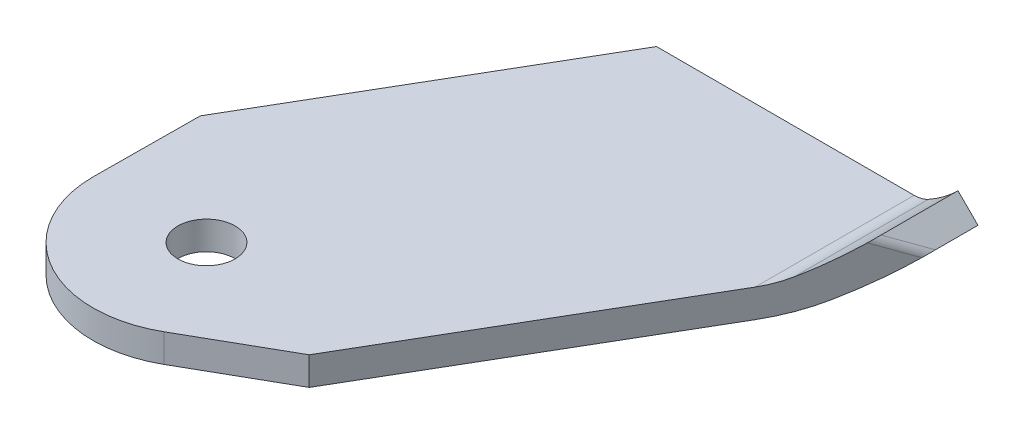
ISO-10303-21;
HEADER;
FILE_DESCRIPTION(('STEP AP214'),'2;1');
FILE_NAME('part.step','',(''),(''),'','','');
FILE_SCHEMA(('AUTOMOTIVE_DESIGN { 1 0 10303 214 1 1 1 1 }'));
ENDSEC;
DATA;
#1=APPLICATION_CONTEXT('core data for automotive mechanical design processes');
#2=APPLICATION_PROTOCOL_DEFINITION('international standard','automotive_design',2000,#1);
#3=PRODUCT_CONTEXT('',#1,'mechanical');
#4=PRODUCT('Part','Part','',(#3));
#5=PRODUCT_RELATED_PRODUCT_CATEGORY('part','',(#4));
#6=PRODUCT_DEFINITION_FORMATION('','',#4);
#7=PRODUCT_DEFINITION_CONTEXT('part definition',#1,'design');
#8=PRODUCT_DEFINITION('design','',#6,#7);
#9=PRODUCT_DEFINITION_SHAPE('','',#8);
#10=(LENGTH_UNIT() NAMED_UNIT(*) SI_UNIT(.MILLI.,.METRE.));
#11=(NAMED_UNIT(*) PLANE_ANGLE_UNIT() SI_UNIT($,.RADIAN.));
#12=(NAMED_UNIT(*) SI_UNIT($,.STERADIAN.) SOLID_ANGLE_UNIT());
#13=UNCERTAINTY_MEASURE_WITH_UNIT(LENGTH_MEASURE(1.E-05),#10,'distance_accuracy_value','');
#14=(GEOMETRIC_REPRESENTATION_CONTEXT(3) GLOBAL_UNCERTAINTY_ASSIGNED_CONTEXT((#13)) GLOBAL_UNIT_ASSIGNED_CONTEXT((#10,
#11,#12)) REPRESENTATION_CONTEXT('',''));
#15=CARTESIAN_POINT('',(0.,0.,0.));
#16=DIRECTION('',(0.,0.,1.));
#17=DIRECTION('',(1.,0.,0.));
#18=AXIS2_PLACEMENT_3D('',#15,#16,#17);
#19=CARTESIAN_POINT('',(-10.456084695359,115.901962595739,38.6729454499609));
#20=DIRECTION('',(0.450417290441647,-0.448428762397305,-0.772033619427306));
#21=DIRECTION('',(-0.86374756690202,0.,-0.503924737109463));
#22=AXIS2_PLACEMENT_3D('',#19,#20,#21);
#23=CYLINDRICAL_SURFACE('',#22,3.);
#24=CARTESIAN_POINT('',(-7.93483152473506,117.625126118079,37.979391350454));
#25=CARTESIAN_POINT('',(-7.93483054293059,117.625127477199,38.0649478684387));
#26=CARTESIAN_POINT('',(-7.93582868921989,117.624124549381,38.1505075727464));
#27=CARTESIAN_POINT('',(-7.93986251081837,117.620073288824,38.3206692474922));
#28=CARTESIAN_POINT('',(-7.94287761276108,117.617045609068,38.4052722031207));
#29=CARTESIAN_POINT('',(-7.9509460541811,117.608946628468,38.5735212678651));
#30=CARTESIAN_POINT('',(-7.95598085607057,117.603893914545,38.6571691494448));
#31=CARTESIAN_POINT('',(-7.96808871180446,117.591749864278,38.8235067847595));
#32=CARTESIAN_POINT('',(-7.9751454763953,117.584674821192,38.9061989087678));
#33=CARTESIAN_POINT('',(-7.99129834359235,117.568491836456,39.070624652166));
#34=CARTESIAN_POINT('',(-8.00038058122044,117.559397717796,39.1523609893333));
#35=CARTESIAN_POINT('',(-8.02058651185715,117.53918325849,39.314874621066));
#36=CARTESIAN_POINT('',(-8.03169891509625,117.528074125692,39.395654711068));
#37=CARTESIAN_POINT('',(-8.0559668781795,117.503838632012,39.5562565616188));
#38=CARTESIAN_POINT('',(-8.06911384927091,117.490720753216,39.6360808968617));
#39=CARTESIAN_POINT('',(-8.09745816948878,117.462473237155,39.7947687952996));
#40=CARTESIAN_POINT('',(-8.11264969847188,117.447349312109,39.8736344170208));
#41=CARTESIAN_POINT('',(-8.1468546797271,117.413342832059,40.0390263913299));
#42=CARTESIAN_POINT('',(-8.16610387964836,117.394230592357,40.1254571618939));
#43=CARTESIAN_POINT('',(-8.20677861540937,117.353914879864,40.294861044084));
#44=CARTESIAN_POINT('',(-8.22813602143134,117.332777274314,40.37786608925));
#45=CARTESIAN_POINT('',(-8.27304002995458,117.288419419526,40.5404133503717));
#46=CARTESIAN_POINT('',(-8.29652103690272,117.265262054567,40.6199907368286));
#47=CARTESIAN_POINT('',(-8.34567936952535,117.21688094078,40.7756800076843));
#48=CARTESIAN_POINT('',(-8.37129486813309,117.191715908444,40.8518295592461));
#49=CARTESIAN_POINT('',(-8.42473075853494,117.139336246609,41.0006607268705));
#50=CARTESIAN_POINT('',(-8.45249419955261,117.112175142482,41.0733815312648));
#51=CARTESIAN_POINT('',(-8.51023321129659,117.05582342348,41.2153539763701));
#52=CARTESIAN_POINT('',(-8.5401578645651,117.026680110428,41.2846450240977));
#53=CARTESIAN_POINT('',(-8.60222905658824,116.966383293369,41.4197580606625));
#54=CARTESIAN_POINT('',(-8.63433171264459,116.935270034976,41.4856180768208));
#55=CARTESIAN_POINT('',(-8.70075890816245,116.871064739446,41.6138709055506));
#56=CARTESIAN_POINT('',(-8.73504761821407,116.838005070949,41.6762985132343));
#57=CARTESIAN_POINT('',(-8.77065232305184,116.803773900834,41.7373155344688));
#58=B_SPLINE_CURVE_WITH_KNOTS('',3,(#24,#25,#26,#27,#28,#29,#30,#31,#32,#33,#34,#35,#36,#37,#38,
#39,#40,#41,#42,#43,#44,#45,#46,#47,#48,#49,#50,#51,#52,#53,#54,#55,#56,#57),.UNSPECIFIED.,.F.,
.F.,(4,2,2,2,2,2,2,2,2,2,2,2,2,2,2,2,4),(0.,0.256662446577546,0.510746011295179,
0.762548989300532,1.01237784490736,1.26054635607007,1.50737463288205,1.75318802140832,
1.99831590873342,2.26999720648141,2.53474061456374,2.79306826012753,3.04554207762139,
3.29276392181494,3.53537473688571,3.77405261707466,4.00950963840103),.UNSPECIFIED.);
#59=CARTESIAN_POINT('',(-7.93483152473503,117.625126118079,37.9793913504539));
#60=VERTEX_POINT('',#59);
#61=CARTESIAN_POINT('',(-8.77065232305181,116.803773900834,41.7373155344687));
#62=VERTEX_POINT('',#61);
#63=EDGE_CURVE('E248',#60,#62,#58,.T.);
#64=ORIENTED_EDGE('',*,*,#63,.F.);
#65=DIRECTION('',(0.450417290441647,-0.448428762397305,-0.772033619427307));
#66=VECTOR('',#65,1.);
#67=CARTESIAN_POINT('',(-8.74342269051327,118.430147469279,39.3653496109387));
#68=LINE('',#67,#66);
#69=CARTESIAN_POINT('',(-14.6671907096273,124.327762898153,49.5189297720377));
#70=VERTEX_POINT('',#69);
#71=EDGE_CURVE('E333',#70,#60,#68,.T.);
#72=ORIENTED_EDGE('',*,*,#71,.F.);
#73=CARTESIAN_POINT('',(-15.5049722204054,123.508362737103,53.280214697237));
#74=CARTESIAN_POINT('',(-15.4682315740175,123.543354162819,53.2172469055204));
#75=CARTESIAN_POINT('',(-15.4329438236482,123.577080956087,53.1527525131535));
#76=CARTESIAN_POINT('',(-15.364468670612,123.642729225121,53.0196967366038));
#77=CARTESIAN_POINT('',(-15.3313411597339,123.674597715511,52.9510783035288));
#78=CARTESIAN_POINT('',(-15.2671670968623,123.736510036142,52.8097814987494));
#79=CARTESIAN_POINT('',(-15.2361888727953,123.766492354669,52.7370453608492));
#80=CARTESIAN_POINT('',(-15.1762846290425,123.824625980085,52.5875127422796));
#81=CARTESIAN_POINT('',(-15.1474334698377,123.852708892579,52.5106598214368));
#82=CARTESIAN_POINT('',(-15.0940923882573,123.904758511682,52.3594741385405));
#83=CARTESIAN_POINT('',(-15.0694480922263,123.928868190941,52.2852446797298));
#84=CARTESIAN_POINT('',(-15.0222467069815,123.975143617954,52.1342016491689));
#85=CARTESIAN_POINT('',(-14.9997264030026,123.997274846068,52.0573660259706));
#86=CARTESIAN_POINT('',(-14.9567546105981,124.039585408688,51.9011129866035));
#87=CARTESIAN_POINT('',(-14.9363439706278,124.059725956701,51.8216738830806));
#88=CARTESIAN_POINT('',(-14.897574991296,124.098047887998,51.6602130570305));
#89=CARTESIAN_POINT('',(-14.87926092853,124.116186785262,51.5781706626278));
#90=CARTESIAN_POINT('',(-14.8458068450344,124.149371582356,51.4169527004037));
#91=CARTESIAN_POINT('',(-14.8305589306193,124.164521990434,51.3378208991374));
#92=CARTESIAN_POINT('',(-14.8020700336802,124.192864421894,51.1781248156776));
#93=CARTESIAN_POINT('',(-14.788847444746,124.206038476542,51.0975540665403));
#94=CARTESIAN_POINT('',(-14.7643979763619,124.230424219875,50.9349811529772));
#95=CARTESIAN_POINT('',(-14.7531921830521,124.241615157776,50.8529727166674));
#96=CARTESIAN_POINT('',(-14.7327668327024,124.262031299777,50.6875240844299));
#97=CARTESIAN_POINT('',(-14.7235708124037,124.271233197559,50.6040781193571));
#98=CARTESIAN_POINT('',(-14.7073664824815,124.287458992798,50.4378730592196));
#99=CARTESIAN_POINT('',(-14.700331201326,124.294509734128,50.3551192023846));
#100=CARTESIAN_POINT('',(-14.6882710972484,124.306602215896,50.1891310858977));
#101=CARTESIAN_POINT('',(-14.6832508184413,124.311639415409,50.1058961650805));
#102=CARTESIAN_POINT('',(-14.6752151811639,124.319704370106,49.9389467195466));
#103=CARTESIAN_POINT('',(-14.6722067449615,124.322725187335,49.8552315284302));
#104=CARTESIAN_POINT('',(-14.668189191057,124.326760006331,49.6873206677586));
#105=CARTESIAN_POINT('',(-14.6671892957897,124.327764751058,49.6031245540018));
#106=CARTESIAN_POINT('',(-14.6671907096273,124.327762898152,49.5189297720377));
#107=B_SPLINE_CURVE_WITH_KNOTS('',3,(#73,#74,#75,#76,#77,#78,#79,#80,#81,#82,#83,#84,#85,#86,
#87,#88,#89,#90,#91,#92,#93,#94,#95,#96,#97,#98,#99,#100,#101,#102,#103,#104,#105,#106),
.UNSPECIFIED.,.F.,.F.,(4,2,2,2,2,2,2,2,2,2,2,2,2,2,2,2,4),(0.,0.242532244796268,
0.490172726903803,0.743709513747707,1.00387709736568,1.2493300935248,1.49845899276499,
1.75174998255762,2.0096657141544,2.25560582996426,2.50366170705772,2.7541769268469,
3.00748506361581,3.25748908813096,3.50805378134933,3.75947623165856,4.01205050069716),.UNSPECIFIED.);
#108=CARTESIAN_POINT('',(-15.5049722204054,123.508362737103,53.280214697237));
#109=VERTEX_POINT('',#108);
#110=EDGE_CURVE('E30',#109,#70,#107,.T.);
#111=ORIENTED_EDGE('',*,*,#110,.F.);
#112=DIRECTION('',(-0.450417290441646,0.448428762397305,0.772033619427307));
#113=VECTOR('',#112,1.);
#114=CARTESIAN_POINT('',(-15.0011613157754,123.006776085703,52.4166622438508));
#115=LINE('',#114,#113);
#116=EDGE_CURVE('E321',#62,#109,#115,.T.);
#117=ORIENTED_EDGE('',*,*,#116,.F.);
#118=EDGE_LOOP('',(#64,#72,#111,#117));
#119=FACE_BOUND('',#118,.T.);
#120=ADVANCED_FACE('F17',(#119),#23,.T.);
#121=CARTESIAN_POINT('',(-29.3784069820497,125.625126118079,103.704684572446));
#122=DIRECTION('',(0.,0.,-1.));
#123=DIRECTION('',(-1.,0.,0.));
#124=AXIS2_PLACEMENT_3D('',#121,#122,#123);
#125=CYLINDRICAL_SURFACE('',#124,19.5);
#126=CARTESIAN_POINT('',(-29.3784069820497,106.125126118079,77.0598481176562));
#127=CARTESIAN_POINT('',(-26.0536113774372,106.125126118079,71.361012751083));
#128=CARTESIAN_POINT('',(-22.8346710941793,106.957405677643,65.8436177257559));
#129=CARTESIAN_POINT('',(-19.9265563010478,108.568968323779,60.8589902767299));
#130=(BOUNDED_CURVE() B_SPLINE_CURVE(3,(#126,#127,#128,#129),.UNSPECIFIED.,.F.,
.F.) B_SPLINE_CURVE_WITH_KNOTS((4,4),(4.71238898038469,5.21842089892061),
.UNSPECIFIED.) CURVE() GEOMETRIC_REPRESENTATION_ITEM() RATIONAL_B_SPLINE_CURVE((1.,
0.978774570641756,0.978774570641756,1.)) REPRESENTATION_ITEM(''));
#131=CARTESIAN_POINT('',(-29.3784069820497,106.125126118079,77.0598481176562));
#132=VERTEX_POINT('',#131);
#133=CARTESIAN_POINT('',(-19.9265563010478,108.568968323779,60.8589902767299));
#134=VERTEX_POINT('',#133);
#135=EDGE_CURVE('E141',#132,#134,#130,.T.);
#136=ORIENTED_EDGE('',*,*,#135,.F.);
#137=DIRECTION('',(0.,0.,1.));
#138=VECTOR('',#137,1.);
#139=CARTESIAN_POINT('',(-29.3784069820497,106.125126118079,156.214684572446));
#140=LINE('',#139,#138);
#141=CARTESIAN_POINT('',(-29.3784069820497,106.125126118079,23.7046845724459));
#142=VERTEX_POINT('',#141);
#143=EDGE_CURVE('E230',#142,#132,#140,.T.);
#144=ORIENTED_EDGE('',*,*,#143,.F.);
#145=CARTESIAN_POINT('',(-29.3784069820497,125.625126118079,23.7046845724459));
#146=DIRECTION('',(0.,0.,-1.));
#147=DIRECTION('',(1.,0.,0.));
#148=AXIS2_PLACEMENT_3D('',#145,#146,#147);
#149=CIRCLE('',#148,19.5);
#150=CARTESIAN_POINT('',(-19.9265563010478,108.568968323779,23.7046845724459));
#151=VERTEX_POINT('',#150);
#152=EDGE_CURVE('E186',#151,#142,#149,.T.);
#153=ORIENTED_EDGE('',*,*,#152,.F.);
#154=DIRECTION('',(0.,0.,-1.));
#155=VECTOR('',#154,1.);
#156=CARTESIAN_POINT('',(-19.9265563010478,108.568968323779,103.704684572446));
#157=LINE('',#156,#155);
#158=EDGE_CURVE('E243',#134,#151,#157,.T.);
#159=ORIENTED_EDGE('',*,*,#158,.F.);
#160=EDGE_LOOP('',(#136,#144,#153,#159));
#161=FACE_BOUND('',#160,.T.);
#162=ADVANCED_FACE('F19',(#161),#125,.T.);
#163=CARTESIAN_POINT('',(-29.3784069820497,125.625126118079,103.704684572446));
#164=DIRECTION('',(0.,0.,-1.));
#165=DIRECTION('',(-1.,0.,0.));
#166=AXIS2_PLACEMENT_3D('',#163,#164,#165);
#167=CYLINDRICAL_SURFACE('',#166,10.);
#168=CARTESIAN_POINT('',(-24.5313040687154,116.878378531259,68.7517158915402));
#169=CARTESIAN_POINT('',(-26.02264498827,116.051936148625,71.307935096169));
#170=CARTESIAN_POINT('',(-27.673383595069,115.625126118079,74.1373684424905));
#171=CARTESIAN_POINT('',(-29.3784069820497,115.625126118079,77.0598481176563));
#172=(BOUNDED_CURVE() B_SPLINE_CURVE(3,(#168,#169,#170,#171),.UNSPECIFIED.,.F.,
.F.) B_SPLINE_CURVE_WITH_KNOTS((4,4),(1.06476440825898,1.5707963267949),
.UNSPECIFIED.) CURVE() GEOMETRIC_REPRESENTATION_ITEM() RATIONAL_B_SPLINE_CURVE((1.,
0.978774570641756,0.978774570641756,1.)) REPRESENTATION_ITEM(''));
#173=CARTESIAN_POINT('',(-24.5313040687154,116.878378531259,68.7517158915402));
#174=VERTEX_POINT('',#173);
#175=CARTESIAN_POINT('',(-29.3784069820497,115.625126118079,77.0598481176563));
#176=VERTEX_POINT('',#175);
#177=EDGE_CURVE('E130',#174,#176,#172,.T.);
#178=ORIENTED_EDGE('',*,*,#177,.F.);
#179=DIRECTION('',(0.,0.,1.));
#180=VECTOR('',#179,1.);
#181=CARTESIAN_POINT('',(-24.5313040687154,116.878378531259,103.704684572446));
#182=LINE('',#181,#180);
#183=CARTESIAN_POINT('',(-24.5313040687154,116.878378531259,23.7046845724459));
#184=VERTEX_POINT('',#183);
#185=EDGE_CURVE('E11',#184,#174,#182,.T.);
#186=ORIENTED_EDGE('',*,*,#185,.F.);
#187=CARTESIAN_POINT('',(-29.3784069820497,125.625126118079,23.7046845724459));
#188=DIRECTION('',(0.,0.,1.));
#189=DIRECTION('',(1.,0.,0.));
#190=AXIS2_PLACEMENT_3D('',#187,#188,#189);
#191=CIRCLE('',#190,10.);
#192=CARTESIAN_POINT('',(-29.3784069820497,115.625126118079,23.7046845724459));
#193=VERTEX_POINT('',#192);
#194=EDGE_CURVE('E147',#193,#184,#191,.T.);
#195=ORIENTED_EDGE('',*,*,#194,.F.);
#196=DIRECTION('',(0.,0.,-1.));
#197=VECTOR('',#196,1.);
#198=CARTESIAN_POINT('',(-29.3784069820497,115.625126118079,23.7046845724459));
#199=LINE('',#198,#197);
#200=EDGE_CURVE('E144',#176,#193,#199,.T.);
#201=ORIENTED_EDGE('',*,*,#200,.F.);
#202=EDGE_LOOP('',(#178,#186,#195,#201));
#203=FACE_BOUND('',#202,.T.);
#204=ADVANCED_FACE('F145',(#203),#167,.F.);
#205=CARTESIAN_POINT('',(-45.8800116393542,155.40278367882,103.704684572446));
#206=DIRECTION('',(0.,0.,-1.));
#207=DIRECTION('',(-1.,0.,0.));
#208=AXIS2_PLACEMENT_3D('',#205,#206,#207);
#209=CYLINDRICAL_SURFACE('',#208,44.0442630419687);
#210=CARTESIAN_POINT('',(-15.5049722204054,123.508362737103,53.280214697237));
#211=CARTESIAN_POINT('',(-18.2230580833322,120.919760630755,57.9391248039338));
#212=CARTESIAN_POINT('',(-21.2482019487365,118.6977443804,63.1243448593326));
#213=CARTESIAN_POINT('',(-24.5313040687154,116.878378531259,68.7517158915402));
#214=(BOUNDED_CURVE() B_SPLINE_CURVE(3,(#210,#211,#212,#213),.UNSPECIFIED.,.F.,
.F.) B_SPLINE_CURVE_WITH_KNOTS((4,4),(0.809793430236965,1.06476440825898),
.UNSPECIFIED.) CURVE() GEOMETRIC_REPRESENTATION_ITEM() RATIONAL_B_SPLINE_CURVE((1.,
0.99458981676162,0.99458981676162,1.)) REPRESENTATION_ITEM(''));
#215=EDGE_CURVE('E137',#109,#174,#214,.T.);
#216=ORIENTED_EDGE('',*,*,#215,.F.);
#217=ORIENTED_EDGE('',*,*,#110,.T.);
#218=DIRECTION('',(0.,0.,-1.));
#219=VECTOR('',#218,1.);
#220=CARTESIAN_POINT('',(-14.6671907096273,124.327762898153,103.704684572446));
#221=LINE('',#220,#219);
#222=CARTESIAN_POINT('',(-14.6671907096273,124.327762898153,23.7046845724459));
#223=VERTEX_POINT('',#222);
#224=EDGE_CURVE('E247',#70,#223,#221,.T.);
#225=ORIENTED_EDGE('',*,*,#224,.T.);
#226=CARTESIAN_POINT('',(-45.8800116393542,155.40278367882,23.7046845724459));
#227=DIRECTION('',(0.,0.,1.));
#228=DIRECTION('',(1.,0.,0.));
#229=AXIS2_PLACEMENT_3D('',#226,#227,#228);
#230=CIRCLE('',#229,44.0442630419687);
#231=EDGE_CURVE('E185',#184,#223,#230,.T.);
#232=ORIENTED_EDGE('',*,*,#231,.F.);
#233=ORIENTED_EDGE('',*,*,#185,.T.);
#234=EDGE_LOOP('',(#216,#217,#225,#232,#233));
#235=FACE_BOUND('',#234,.T.);
#236=ADVANCED_FACE('F261',(#235),#209,.F.);
#237=CARTESIAN_POINT('',(-7.93483152473503,117.625126118079,103.704684572446));
#238=DIRECTION('',(0.705540713691974,0.708669387883391,0.));
#239=DIRECTION('',(0.,0.,-1.));
#240=AXIS2_PLACEMENT_3D('',#237,#238,#239);
#241=PLANE('',#240);
#242=ORIENTED_EDGE('',*,*,#224,.F.);
#243=ORIENTED_EDGE('',*,*,#71,.T.);
#244=DIRECTION('',(0.,0.,-1.));
#245=VECTOR('',#244,1.);
#246=CARTESIAN_POINT('',(-7.93483152473503,117.625126118079,103.704684572446));
#247=LINE('',#246,#245);
#248=CARTESIAN_POINT('',(-7.93483152473503,117.625126118079,23.7046845724459));
#249=VERTEX_POINT('',#248);
#250=EDGE_CURVE('E242',#60,#249,#247,.T.);
#251=ORIENTED_EDGE('',*,*,#250,.T.);
#252=DIRECTION('',(0.708669387883391,-0.705540713691974,0.));
#253=VECTOR('',#252,1.);
#254=CARTESIAN_POINT('',(-7.93483152473503,117.625126118079,23.7046845724459));
#255=LINE('',#254,#253);
#256=EDGE_CURVE('E225',#223,#249,#255,.T.);
#257=ORIENTED_EDGE('',*,*,#256,.F.);
#258=EDGE_LOOP('',(#242,#243,#251,#257));
#259=FACE_BOUND('',#258,.T.);
#260=ADVANCED_FACE('F270',(#259),#241,.T.);
#261=CARTESIAN_POINT('',(-45.8800116393542,155.40278367882,103.704684572446));
#262=DIRECTION('',(0.,0.,-1.));
#263=DIRECTION('',(-1.,0.,0.));
#264=AXIS2_PLACEMENT_3D('',#261,#262,#263);
#265=CYLINDRICAL_SURFACE('',#264,53.5442630419687);
#266=ORIENTED_EDGE('',*,*,#250,.F.);
#267=ORIENTED_EDGE('',*,*,#63,.T.);
#268=CARTESIAN_POINT('',(-19.9265563010478,108.568968323779,60.8589902767299));
#269=CARTESIAN_POINT('',(-15.86099034523,110.821944803687,53.8904442939306));
#270=CARTESIAN_POINT('',(-12.1213684432743,113.582371870381,47.4805797227337));
#271=CARTESIAN_POINT('',(-8.77065232305181,116.803773900834,41.7373155344687));
#272=(BOUNDED_CURVE() B_SPLINE_CURVE(3,(#268,#269,#270,#271),.UNSPECIFIED.,.F.,
.F.) B_SPLINE_CURVE_WITH_KNOTS((4,4),(5.21842089892061,5.4781135160974),
.UNSPECIFIED.) CURVE() GEOMETRIC_REPRESENTATION_ITEM() RATIONAL_B_SPLINE_CURVE((1.,
0.99438787043881,0.99438787043881,1.)) REPRESENTATION_ITEM(''));
#273=EDGE_CURVE('E208',#134,#62,#272,.T.);
#274=ORIENTED_EDGE('',*,*,#273,.F.);
#275=ORIENTED_EDGE('',*,*,#158,.T.);
#276=CARTESIAN_POINT('',(-45.8800116393542,155.40278367882,23.7046845724459));
#277=DIRECTION('',(0.,0.,1.));
#278=DIRECTION('',(1.,0.,0.));
#279=AXIS2_PLACEMENT_3D('',#276,#277,#278);
#280=CIRCLE('',#279,53.5442630419687);
#281=EDGE_CURVE('E200',#151,#249,#280,.T.);
#282=ORIENTED_EDGE('',*,*,#281,.T.);
#283=EDGE_LOOP('',(#266,#267,#274,#275,#282));
#284=FACE_BOUND('',#283,.T.);
#285=ADVANCED_FACE('F271',(#284),#265,.T.);
#286=CARTESIAN_POINT('',(-115.874831524735,115.625126118079,23.7046845724459));
#287=DIRECTION('',(0.,0.,1.));
#288=DIRECTION('',(1.,0.,0.));
#289=AXIS2_PLACEMENT_3D('',#286,#287,#288);
#290=PLANE('',#289);
#291=ORIENTED_EDGE('',*,*,#281,.F.);
#292=ORIENTED_EDGE('',*,*,#152,.T.);
#293=DIRECTION('',(-1.,0.,0.));
#294=VECTOR('',#293,1.);
#295=CARTESIAN_POINT('',(-115.874831524735,106.125126118079,23.7046845724459));
#296=LINE('',#295,#294);
#297=CARTESIAN_POINT('',(-115.874831524735,106.125126118079,23.7046845724459));
#298=VERTEX_POINT('',#297);
#299=EDGE_CURVE('E218',#142,#298,#296,.T.);
#300=ORIENTED_EDGE('',*,*,#299,.T.);
#301=DIRECTION('',(0.,-1.,0.));
#302=VECTOR('',#301,1.);
#303=CARTESIAN_POINT('',(-115.874831524735,115.625126118079,23.7046845724459));
#304=LINE('',#303,#302);
#305=CARTESIAN_POINT('',(-115.874831524735,115.625126118079,23.7046845724459));
#306=VERTEX_POINT('',#305);
#307=EDGE_CURVE('E173',#306,#298,#304,.T.);
#308=ORIENTED_EDGE('',*,*,#307,.F.);
#309=DIRECTION('',(-1.,0.,0.));
#310=VECTOR('',#309,1.);
#311=CARTESIAN_POINT('',(-115.874831524735,115.625126118079,23.7046845724459));
#312=LINE('',#311,#310);
#313=EDGE_CURVE('E152',#193,#306,#312,.T.);
#314=ORIENTED_EDGE('',*,*,#313,.F.);
#315=ORIENTED_EDGE('',*,*,#194,.T.);
#316=ORIENTED_EDGE('',*,*,#231,.T.);
#317=ORIENTED_EDGE('',*,*,#256,.T.);
#318=EDGE_LOOP('',(#291,#292,#300,#308,#314,#315,#316,#317));
#319=FACE_BOUND('',#318,.T.);
#320=ADVANCED_FACE('F275',(#319),#290,.F.);
#321=CARTESIAN_POINT('',(-7.93483152473503,115.625126118079,40.304684572446));
#322=DIRECTION('',(-0.86374756690202,0.,-0.503924737109463));
#323=DIRECTION('',(-0.503924737109463,0.,0.86374756690202));
#324=AXIS2_PLACEMENT_3D('',#321,#322,#323);
#325=PLANE('',#324);
#326=ORIENTED_EDGE('',*,*,#273,.T.);
#327=ORIENTED_EDGE('',*,*,#116,.T.);
#328=ORIENTED_EDGE('',*,*,#215,.T.);
#329=ORIENTED_EDGE('',*,*,#177,.T.);
#330=DIRECTION('',(0.503924737109463,0.,-0.86374756690202));
#331=VECTOR('',#330,1.);
#332=CARTESIAN_POINT('',(-7.93483152473503,115.625126118079,40.304684572446));
#333=LINE('',#332,#331);
#334=CARTESIAN_POINT('',(-84.5565878022288,115.625126118079,171.637502119898));
#335=VERTEX_POINT('',#334);
#336=EDGE_CURVE('E135',#335,#176,#333,.T.);
#337=ORIENTED_EDGE('',*,*,#336,.F.);
#338=DIRECTION('',(0.,-1.,0.));
#339=VECTOR('',#338,1.);
#340=CARTESIAN_POINT('',(-84.5565878022288,115.625126118079,171.637502119898));
#341=LINE('',#340,#339);
#342=CARTESIAN_POINT('',(-84.5565878022288,106.125126118079,171.637502119898));
#343=VERTEX_POINT('',#342);
#344=EDGE_CURVE('E205',#335,#343,#341,.T.);
#345=ORIENTED_EDGE('',*,*,#344,.T.);
#346=DIRECTION('',(0.503924737109463,0.,-0.86374756690202));
#347=VECTOR('',#346,1.);
#348=CARTESIAN_POINT('',(-7.93483152473503,106.125126118079,40.304684572446));
#349=LINE('',#348,#347);
#350=EDGE_CURVE('E226',#343,#132,#349,.T.);
#351=ORIENTED_EDGE('',*,*,#350,.T.);
#352=ORIENTED_EDGE('',*,*,#135,.T.);
#353=EDGE_LOOP('',(#326,#327,#328,#329,#337,#345,#351,#352));
#354=FACE_BOUND('',#353,.T.);
#355=ADVANCED_FACE('F133',(#354),#325,.F.);
#356=CARTESIAN_POINT('',(-84.5565878022288,115.625126118079,171.637502119898));
#357=DIRECTION('',(-0.49474939936503,0.,-0.869035690767613));
#358=DIRECTION('',(-0.869035690767613,0.,0.49474939936503));
#359=AXIS2_PLACEMENT_3D('',#356,#357,#358);
#360=PLANE('',#359);
#361=DIRECTION('',(0.869035690767613,0.,-0.49474939936503));
#362=VECTOR('',#361,1.);
#363=CARTESIAN_POINT('',(-84.5565878022288,106.125126118079,171.637502119898));
#364=LINE('',#363,#362);
#365=CARTESIAN_POINT('',(-115.624879408927,106.125126118079,189.324944390692));
#366=VERTEX_POINT('',#365);
#367=EDGE_CURVE('E215',#366,#343,#364,.T.);
#368=ORIENTED_EDGE('',*,*,#367,.T.);
#369=ORIENTED_EDGE('',*,*,#344,.F.);
#370=DIRECTION('',(0.869035690767613,0.,-0.49474939936503));
#371=VECTOR('',#370,1.);
#372=CARTESIAN_POINT('',(-84.5565878022288,115.625126118079,171.637502119898));
#373=LINE('',#372,#371);
#374=CARTESIAN_POINT('',(-115.624879408927,115.625126118079,189.324944390692));
#375=VERTEX_POINT('',#374);
#376=EDGE_CURVE('E158',#375,#335,#373,.T.);
#377=ORIENTED_EDGE('',*,*,#376,.F.);
#378=DIRECTION('',(0.,-1.,0.));
#379=VECTOR('',#378,1.);
#380=CARTESIAN_POINT('',(-115.624879408927,115.625126118079,189.324944390692));
#381=LINE('',#380,#379);
#382=EDGE_CURVE('E209',#375,#366,#381,.T.);
#383=ORIENTED_EDGE('',*,*,#382,.T.);
#384=EDGE_LOOP('',(#368,#369,#377,#383));
#385=FACE_BOUND('',#384,.T.);
#386=ADVANCED_FACE('F499',(#385),#360,.F.);
#387=CARTESIAN_POINT('',(-134.474831524735,115.625126118079,156.214684572446));
#388=DIRECTION('',(0.,-1.,0.));
#389=DIRECTION('',(0.,0.,-1.));
#390=AXIS2_PLACEMENT_3D('',#387,#388,#389);
#391=CYLINDRICAL_SURFACE('',#390,38.1);
#392=CARTESIAN_POINT('',(-134.474831524735,106.125126118079,156.214684572446));
#393=DIRECTION('',(0.,1.,0.));
#394=DIRECTION('',(0.,0.,1.));
#395=AXIS2_PLACEMENT_3D('',#392,#393,#394);
#396=CIRCLE('',#395,38.1);
#397=CARTESIAN_POINT('',(-172.573774461047,106.125126118079,155.930876299766));
#398=VERTEX_POINT('',#397);
#399=EDGE_CURVE('E190',#398,#366,#396,.T.);
#400=ORIENTED_EDGE('',*,*,#399,.T.);
#401=ORIENTED_EDGE('',*,*,#382,.F.);
#402=CARTESIAN_POINT('',(-134.474831524735,115.625126118079,156.214684572446));
#403=DIRECTION('',(0.,1.,0.));
#404=DIRECTION('',(0.,0.,1.));
#405=AXIS2_PLACEMENT_3D('',#402,#403,#404);
#406=CIRCLE('',#405,38.1);
#407=CARTESIAN_POINT('',(-172.573774461047,115.625126118079,155.930876299766));
#408=VERTEX_POINT('',#407);
#409=EDGE_CURVE('E171',#408,#375,#406,.T.);
#410=ORIENTED_EDGE('',*,*,#409,.F.);
#411=DIRECTION('',(0.,-1.,0.));
#412=VECTOR('',#411,1.);
#413=CARTESIAN_POINT('',(-172.573774461047,115.625126118079,155.930876299766));
#414=LINE('',#413,#412);
#415=EDGE_CURVE('E176',#408,#398,#414,.T.);
#416=ORIENTED_EDGE('',*,*,#415,.T.);
#417=EDGE_LOOP('',(#400,#401,#410,#416));
#418=FACE_BOUND('',#417,.T.);
#419=ADVANCED_FACE('F503',(#418),#391,.T.);
#420=CARTESIAN_POINT('',(-172.309362833624,115.625126118079,120.435774589803));
#421=DIRECTION('',(0.999972255546247,0.,0.00744903602834086));
#422=DIRECTION('',(0.,-1.,0.));
#423=AXIS2_PLACEMENT_3D('',#420,#421,#422);
#424=PLANE('',#423);
#425=DIRECTION('',(-0.00744903602834086,0.,0.999972255546247));
#426=VECTOR('',#425,1.);
#427=CARTESIAN_POINT('',(-172.309362833624,106.125126118079,120.435774589803));
#428=LINE('',#427,#426);
#429=CARTESIAN_POINT('',(-172.309362833624,106.125126118079,120.435774589803));
#430=VERTEX_POINT('',#429);
#431=EDGE_CURVE('E182',#430,#398,#428,.T.);
#432=ORIENTED_EDGE('',*,*,#431,.T.);
#433=ORIENTED_EDGE('',*,*,#415,.F.);
#434=DIRECTION('',(-0.00744903602834086,0.,0.999972255546247));
#435=VECTOR('',#434,1.);
#436=CARTESIAN_POINT('',(-172.309362833624,115.625126118079,120.435774589803));
#437=LINE('',#436,#435);
#438=CARTESIAN_POINT('',(-172.309362833624,115.625126118079,120.435774589803));
#439=VERTEX_POINT('',#438);
#440=EDGE_CURVE('E191',#439,#408,#437,.T.);
#441=ORIENTED_EDGE('',*,*,#440,.F.);
#442=DIRECTION('',(0.,-1.,0.));
#443=VECTOR('',#442,1.);
#444=CARTESIAN_POINT('',(-172.309362833624,115.625126118079,120.435774589803));
#445=LINE('',#444,#443);
#446=EDGE_CURVE('E177',#439,#430,#445,.T.);
#447=ORIENTED_EDGE('',*,*,#446,.T.);
#448=EDGE_LOOP('',(#432,#433,#441,#447));
#449=FACE_BOUND('',#448,.T.);
#450=ADVANCED_FACE('F477',(#449),#424,.F.);
#451=CARTESIAN_POINT('',(-115.874831524735,115.625126118079,23.7046845724459));
#452=DIRECTION('',(0.86374756690202,0.,0.503924737109463));
#453=DIRECTION('',(0.,-1.,0.));
#454=AXIS2_PLACEMENT_3D('',#451,#452,#453);
#455=PLANE('',#454);
#456=DIRECTION('',(-0.503924737109463,0.,0.86374756690202));
#457=VECTOR('',#456,1.);
#458=CARTESIAN_POINT('',(-115.874831524735,106.125126118079,23.7046845724459));
#459=LINE('',#458,#457);
#460=EDGE_CURVE('E178',#298,#430,#459,.T.);
#461=ORIENTED_EDGE('',*,*,#460,.T.);
#462=ORIENTED_EDGE('',*,*,#446,.F.);
#463=DIRECTION('',(-0.503924737109463,0.,0.86374756690202));
#464=VECTOR('',#463,1.);
#465=CARTESIAN_POINT('',(-115.874831524735,115.625126118079,23.7046845724459));
#466=LINE('',#465,#464);
#467=EDGE_CURVE('E195',#306,#439,#466,.T.);
#468=ORIENTED_EDGE('',*,*,#467,.F.);
#469=ORIENTED_EDGE('',*,*,#307,.T.);
#470=EDGE_LOOP('',(#461,#462,#468,#469));
#471=FACE_BOUND('',#470,.T.);
#472=ADVANCED_FACE('F472',(#471),#455,.F.);
#473=CARTESIAN_POINT('',(-134.474831524735,106.125126118079,156.214684572446));
#474=DIRECTION('',(0.,1.,0.));
#475=DIRECTION('',(1.,0.,0.));
#476=AXIS2_PLACEMENT_3D('',#473,#474,#475);
#477=PLANE('',#476);
#478=CARTESIAN_POINT('',(-134.474831524735,106.125126118079,156.214684572446));
#479=DIRECTION('',(0.,1.,0.));
#480=DIRECTION('',(0.,0.,1.));
#481=AXIS2_PLACEMENT_3D('',#478,#479,#480);
#482=CIRCLE('',#481,9.6);
#483=CARTESIAN_POINT('',(-134.474831524735,106.125126118079,146.614684572446));
#484=VERTEX_POINT('',#483);
#485=EDGE_CURVE('E160',#484,#484,#482,.T.);
#486=ORIENTED_EDGE('',*,*,#485,.T.);
#487=EDGE_LOOP('',(#486));
#488=FACE_BOUND('',#487,.T.);
#489=ORIENTED_EDGE('',*,*,#299,.F.);
#490=ORIENTED_EDGE('',*,*,#143,.T.);
#491=ORIENTED_EDGE('',*,*,#350,.F.);
#492=ORIENTED_EDGE('',*,*,#367,.F.);
#493=ORIENTED_EDGE('',*,*,#399,.F.);
#494=ORIENTED_EDGE('',*,*,#431,.F.);
#495=ORIENTED_EDGE('',*,*,#460,.F.);
#496=EDGE_LOOP('',(#489,#490,#491,#492,#493,#494,#495));
#497=FACE_BOUND('',#496,.T.);
#498=ADVANCED_FACE('F476',(#488,#497),#477,.F.);
#499=CARTESIAN_POINT('',(-134.474831524735,115.625126118079,156.214684572446));
#500=DIRECTION('',(0.,1.,0.));
#501=DIRECTION('',(1.,0.,0.));
#502=AXIS2_PLACEMENT_3D('',#499,#500,#501);
#503=PLANE('',#502);
#504=CARTESIAN_POINT('',(-134.474831524735,115.625126118079,156.214684572446));
#505=DIRECTION('',(0.,1.,0.));
#506=DIRECTION('',(0.,0.,1.));
#507=AXIS2_PLACEMENT_3D('',#504,#505,#506);
#508=CIRCLE('',#507,9.6);
#509=CARTESIAN_POINT('',(-134.474831524735,115.625126118079,165.814684572446));
#510=VERTEX_POINT('',#509);
#511=EDGE_CURVE('E167',#510,#510,#508,.T.);
#512=ORIENTED_EDGE('',*,*,#511,.F.);
#513=EDGE_LOOP('',(#512));
#514=FACE_BOUND('',#513,.T.);
#515=ORIENTED_EDGE('',*,*,#336,.T.);
#516=ORIENTED_EDGE('',*,*,#200,.T.);
#517=ORIENTED_EDGE('',*,*,#313,.T.);
#518=ORIENTED_EDGE('',*,*,#467,.T.);
#519=ORIENTED_EDGE('',*,*,#440,.T.);
#520=ORIENTED_EDGE('',*,*,#409,.T.);
#521=ORIENTED_EDGE('',*,*,#376,.T.);
#522=EDGE_LOOP('',(#515,#516,#517,#518,#519,#520,#521));
#523=FACE_BOUND('',#522,.T.);
#524=ADVANCED_FACE('F155',(#514,#523),#503,.T.);
#525=CARTESIAN_POINT('',(-134.474831524735,115.625126118079,156.214684572446));
#526=DIRECTION('',(0.,-1.,0.));
#527=DIRECTION('',(0.,0.,-1.));
#528=AXIS2_PLACEMENT_3D('',#525,#526,#527);
#529=CYLINDRICAL_SURFACE('',#528,9.6);
#530=ORIENTED_EDGE('',*,*,#485,.F.);
#531=EDGE_LOOP('',(#530));
#532=FACE_BOUND('',#531,.T.);
#533=ORIENTED_EDGE('',*,*,#511,.T.);
#534=EDGE_LOOP('',(#533));
#535=FACE_BOUND('',#534,.T.);
#536=ADVANCED_FACE('F508',(#532,#535),#529,.F.);
#537=CLOSED_SHELL('',(#120,#162,#204,#236,#260,#285,#320,#355,#386,#419,#450,#472,#498,#524,#536));
#538=MANIFOLD_SOLID_BREP('B1',#537);
#539=ADVANCED_BREP_SHAPE_REPRESENTATION('',(#18,#538),#14);
#540=SHAPE_DEFINITION_REPRESENTATION(#9,#539);
ENDSEC;
END-ISO-10303-21;
